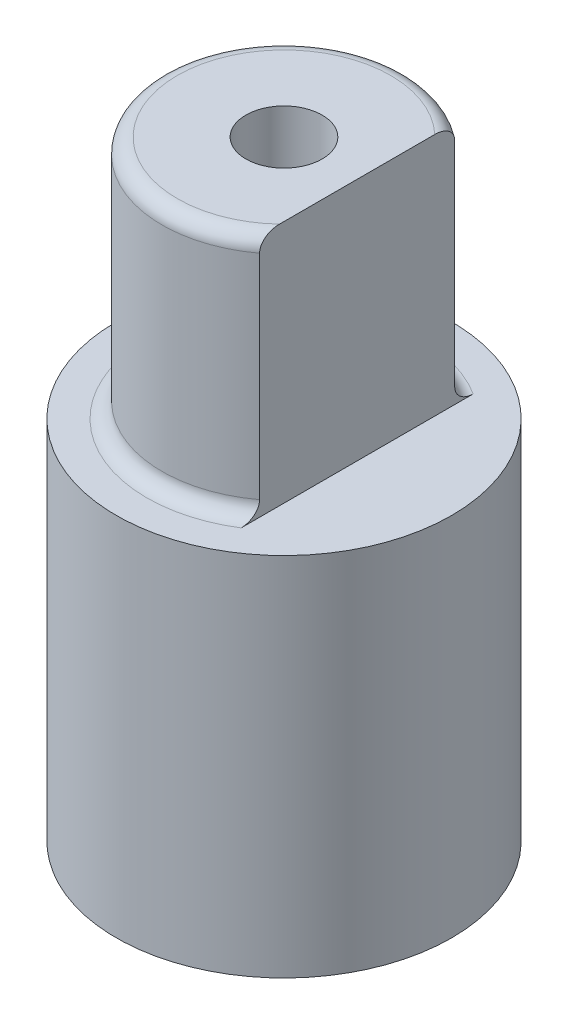
ISO-10303-21;
HEADER;
FILE_DESCRIPTION(('STEP AP214'),'2;1');
FILE_NAME('part.step','',(''),(''),'','','');
FILE_SCHEMA(('AUTOMOTIVE_DESIGN { 1 0 10303 214 1 1 1 1 }'));
ENDSEC;
DATA;
#1=APPLICATION_CONTEXT('core data for automotive mechanical design processes');
#2=APPLICATION_PROTOCOL_DEFINITION('international standard','automotive_design',2000,#1);
#3=PRODUCT_CONTEXT('',#1,'mechanical');
#4=PRODUCT('Part','Part','',(#3));
#5=PRODUCT_RELATED_PRODUCT_CATEGORY('part','',(#4));
#6=PRODUCT_DEFINITION_FORMATION('','',#4);
#7=PRODUCT_DEFINITION_CONTEXT('part definition',#1,'design');
#8=PRODUCT_DEFINITION('design','',#6,#7);
#9=PRODUCT_DEFINITION_SHAPE('','',#8);
#10=(LENGTH_UNIT() NAMED_UNIT(*) SI_UNIT(.MILLI.,.METRE.));
#11=(NAMED_UNIT(*) PLANE_ANGLE_UNIT() SI_UNIT($,.RADIAN.));
#12=(NAMED_UNIT(*) SI_UNIT($,.STERADIAN.) SOLID_ANGLE_UNIT());
#13=UNCERTAINTY_MEASURE_WITH_UNIT(LENGTH_MEASURE(1.E-05),#10,'distance_accuracy_value','');
#14=(GEOMETRIC_REPRESENTATION_CONTEXT(3) GLOBAL_UNCERTAINTY_ASSIGNED_CONTEXT((#13)) GLOBAL_UNIT_ASSIGNED_CONTEXT((#10,
#11,#12)) REPRESENTATION_CONTEXT('',''));
#15=CARTESIAN_POINT('',(0.,0.,0.));
#16=DIRECTION('',(0.,0.,1.));
#17=DIRECTION('',(1.,0.,0.));
#18=AXIS2_PLACEMENT_3D('',#15,#16,#17);
#19=CARTESIAN_POINT('',(-1.,-10.,1.1180339887499));
#20=DIRECTION('',(-1.,0.,0.));
#21=DIRECTION('',(0.,-1.,0.));
#22=AXIS2_PLACEMENT_3D('',#19,#20,#21);
#23=PLANE('',#22);
#24=DIRECTION('',(0.,1.,0.));
#25=VECTOR('',#24,1.);
#26=CARTESIAN_POINT('',(-0.999999999999999,-20.,0.5));
#27=LINE('',#26,#25);
#28=CARTESIAN_POINT('',(-1.,-10.,0.5));
#29=VERTEX_POINT('',#28);
#30=CARTESIAN_POINT('',(-0.999999999999999,-15.8543560762611,0.5));
#31=VERTEX_POINT('',#30);
#32=EDGE_CURVE('E173',#29,#31,#27,.F.);
#33=ORIENTED_EDGE('',*,*,#32,.T.);
#34=CARTESIAN_POINT('',(-0.999999999999999,-17.,0.));
#35=DIRECTION('',(-1.,0.,0.));
#36=DIRECTION('',(0.,-1.,0.));
#37=AXIS2_PLACEMENT_3D('',#34,#35,#36);
#38=CIRCLE('',#37,1.24999999999999);
#39=CARTESIAN_POINT('',(-0.999999999999999,-15.8543560762611,-0.5));
#40=VERTEX_POINT('',#39);
#41=EDGE_CURVE('E155',#31,#40,#38,.T.);
#42=ORIENTED_EDGE('',*,*,#41,.T.);
#43=DIRECTION('',(0.,1.,0.));
#44=VECTOR('',#43,1.);
#45=CARTESIAN_POINT('',(-1.,-10.,-0.5));
#46=LINE('',#45,#44);
#47=CARTESIAN_POINT('',(-1.,-10.,-0.5));
#48=VERTEX_POINT('',#47);
#49=EDGE_CURVE('E170',#40,#48,#46,.T.);
#50=ORIENTED_EDGE('',*,*,#49,.T.);
#51=DIRECTION('',(0.,0.,-1.));
#52=VECTOR('',#51,1.);
#53=CARTESIAN_POINT('',(-1.,-10.,1.1180339887499));
#54=LINE('',#53,#52);
#55=EDGE_CURVE('E338',#29,#48,#54,.T.);
#56=ORIENTED_EDGE('',*,*,#55,.F.);
#57=EDGE_LOOP('',(#33,#42,#50,#56));
#58=FACE_BOUND('',#57,.T.);
#59=ADVANCED_FACE('F69',(#58),#23,.F.);
#60=CARTESIAN_POINT('',(0.,0.,0.));
#61=DIRECTION('',(0.,-1.,0.));
#62=DIRECTION('',(1.,0.,0.));
#63=AXIS2_PLACEMENT_3D('',#60,#61,#62);
#64=PLANE('',#63);
#65=CARTESIAN_POINT('',(0.,0.,0.));
#66=DIRECTION('',(0.,1.,0.));
#67=DIRECTION('',(0.,0.,1.));
#68=AXIS2_PLACEMENT_3D('',#65,#66,#67);
#69=CIRCLE('',#68,1.24999999999999);
#70=CARTESIAN_POINT('',(0.,0.,1.24999999999999));
#71=VERTEX_POINT('',#70);
#72=EDGE_CURVE('E341',#71,#71,#69,.T.);
#73=ORIENTED_EDGE('',*,*,#72,.F.);
#74=EDGE_LOOP('',(#73));
#75=FACE_BOUND('',#74,.T.);
#76=DIRECTION('',(0.,0.,-1.));
#77=VECTOR('',#76,1.);
#78=CARTESIAN_POINT('',(2.4,0.,0.));
#79=LINE('',#78,#77);
#80=CARTESIAN_POINT('',(2.4,0.,2.5475478405714));
#81=VERTEX_POINT('',#80);
#82=CARTESIAN_POINT('',(2.4,0.,-2.5475478405714));
#83=VERTEX_POINT('',#82);
#84=EDGE_CURVE('E335',#81,#83,#79,.T.);
#85=ORIENTED_EDGE('',*,*,#84,.T.);
#86=CARTESIAN_POINT('',(0.,0.,0.));
#87=DIRECTION('',(0.,-1.,0.));
#88=DIRECTION('',(1.,0.,0.));
#89=AXIS2_PLACEMENT_3D('',#86,#87,#88);
#90=CIRCLE('',#89,3.5);
#91=EDGE_CURVE('E164',#83,#81,#90,.F.);
#92=ORIENTED_EDGE('',*,*,#91,.T.);
#93=EDGE_LOOP('',(#85,#92));
#94=FACE_BOUND('',#93,.T.);
#95=ADVANCED_FACE('F288',(#75,#94),#64,.F.);
#96=CARTESIAN_POINT('',(0.,0.,0.));
#97=DIRECTION('',(0.,1.,0.));
#98=DIRECTION('',(-1.,0.,0.));
#99=AXIS2_PLACEMENT_3D('',#96,#97,#98);
#100=CYLINDRICAL_SURFACE('',#99,4.);
#101=DIRECTION('',(0.,1.,0.));
#102=VECTOR('',#101,1.);
#103=CARTESIAN_POINT('',(2.4,0.,3.2));
#104=LINE('',#103,#102);
#105=CARTESIAN_POINT('',(2.4,-7.5,3.2));
#106=VERTEX_POINT('',#105);
#107=CARTESIAN_POINT('',(2.4,-0.5,3.2));
#108=VERTEX_POINT('',#107);
#109=EDGE_CURVE('E272',#106,#108,#104,.T.);
#110=ORIENTED_EDGE('',*,*,#109,.T.);
#111=CARTESIAN_POINT('',(0.,-0.5,0.));
#112=DIRECTION('',(0.,-1.,0.));
#113=DIRECTION('',(1.,0.,0.));
#114=AXIS2_PLACEMENT_3D('',#111,#112,#113);
#115=CIRCLE('',#114,4.);
#116=CARTESIAN_POINT('',(2.4,-0.5,-3.2));
#117=VERTEX_POINT('',#116);
#118=EDGE_CURVE('E257',#108,#117,#115,.T.);
#119=ORIENTED_EDGE('',*,*,#118,.T.);
#120=DIRECTION('',(0.,1.,0.));
#121=VECTOR('',#120,1.);
#122=CARTESIAN_POINT('',(2.4,0.,-3.2));
#123=LINE('',#122,#121);
#124=CARTESIAN_POINT('',(2.4,-7.5,-3.2));
#125=VERTEX_POINT('',#124);
#126=EDGE_CURVE('E370',#117,#125,#123,.F.);
#127=ORIENTED_EDGE('',*,*,#126,.T.);
#128=CARTESIAN_POINT('',(0.,-7.5,0.));
#129=DIRECTION('',(0.,-1.,0.));
#130=DIRECTION('',(1.,0.,0.));
#131=AXIS2_PLACEMENT_3D('',#128,#129,#130);
#132=CIRCLE('',#131,4.);
#133=EDGE_CURVE('E253',#125,#106,#132,.F.);
#134=ORIENTED_EDGE('',*,*,#133,.T.);
#135=EDGE_LOOP('',(#110,#119,#127,#134));
#136=FACE_BOUND('',#135,.T.);
#137=ADVANCED_FACE('F279',(#136),#100,.T.);
#138=CARTESIAN_POINT('',(4.,-8.,0.));
#139=DIRECTION('',(0.,-1.,0.));
#140=DIRECTION('',(1.,0.,0.));
#141=AXIS2_PLACEMENT_3D('',#138,#139,#140);
#142=PLANE('',#141);
#143=CARTESIAN_POINT('',(0.,-8.,0.));
#144=DIRECTION('',(0.,1.,0.));
#145=DIRECTION('',(-1.,0.,0.));
#146=AXIS2_PLACEMENT_3D('',#143,#144,#145);
#147=CIRCLE('',#146,5.5);
#148=CARTESIAN_POINT('',(-5.5,-8.,0.));
#149=VERTEX_POINT('',#148);
#150=EDGE_CURVE('E353',#149,#149,#147,.T.);
#151=ORIENTED_EDGE('',*,*,#150,.T.);
#152=EDGE_LOOP('',(#151));
#153=FACE_BOUND('',#152,.T.);
#154=DIRECTION('',(0.,0.,-1.));
#155=VECTOR('',#154,1.);
#156=CARTESIAN_POINT('',(2.4,-8.,4.6356245595668));
#157=LINE('',#156,#155);
#158=CARTESIAN_POINT('',(2.4,-8.,3.80657326213486));
#159=VERTEX_POINT('',#158);
#160=CARTESIAN_POINT('',(2.4,-8.,-3.80657326213485));
#161=VERTEX_POINT('',#160);
#162=EDGE_CURVE('E90',#159,#161,#157,.T.);
#163=ORIENTED_EDGE('',*,*,#162,.F.);
#164=CARTESIAN_POINT('',(0.,-8.,0.));
#165=DIRECTION('',(0.,-1.,0.));
#166=DIRECTION('',(1.,0.,0.));
#167=AXIS2_PLACEMENT_3D('',#164,#165,#166);
#168=CIRCLE('',#167,4.5);
#169=EDGE_CURVE('E260',#159,#161,#168,.T.);
#170=ORIENTED_EDGE('',*,*,#169,.T.);
#171=EDGE_LOOP('',(#163,#170));
#172=FACE_BOUND('',#171,.T.);
#173=ADVANCED_FACE('F276',(#153,#172),#142,.F.);
#174=CARTESIAN_POINT('',(0.,0.,0.));
#175=DIRECTION('',(0.,1.,0.));
#176=DIRECTION('',(-1.,0.,0.));
#177=AXIS2_PLACEMENT_3D('',#174,#175,#176);
#178=CYLINDRICAL_SURFACE('',#177,5.5);
#179=CARTESIAN_POINT('',(-5.5,-18.25,0.));
#180=CARTESIAN_POINT('',(-5.49999873675926,-18.2499977340868,-0.0692591392984516));
#181=CARTESIAN_POINT('',(-5.49867854673065,-18.2442243862115,-0.138545086129003));
#182=CARTESIAN_POINT('',(-5.493539660153,-18.2213102619691,-0.275144297299659));
#183=CARTESIAN_POINT('',(-5.48971927481324,-18.2041618020224,-0.342456196110362));
#184=CARTESIAN_POINT('',(-5.48000476561469,-18.159065975684,-0.473113835992455));
#185=CARTESIAN_POINT('',(-5.4741128942837,-18.1311303360096,-0.536463797478233));
#186=CARTESIAN_POINT('',(-5.46088910081351,-18.0652914433096,-0.657576137912826));
#187=CARTESIAN_POINT('',(-5.45355719301993,-18.0273882895788,-0.715338572515906));
#188=CARTESIAN_POINT('',(-5.4381132908407,-17.9419989776967,-0.824633802223185));
#189=CARTESIAN_POINT('',(-5.42999098791629,-17.8943737132625,-0.87605646946024));
#190=CARTESIAN_POINT('',(-5.41395325591652,-17.7911905129314,-0.970256949083046));
#191=CARTESIAN_POINT('',(-5.40603784654666,-17.7356318246528,-1.01303394060891));
#192=CARTESIAN_POINT('',(-5.39120791846105,-17.6173339723581,-1.08922299700893));
#193=CARTESIAN_POINT('',(-5.38430657902887,-17.5545165018471,-1.12251627178287));
#194=CARTESIAN_POINT('',(-5.37243480737543,-17.4239952497092,-1.17803034858934));
#195=CARTESIAN_POINT('',(-5.36746412440839,-17.3562921039692,-1.20025258858874));
#196=CARTESIAN_POINT('',(-5.36012172349153,-17.2191204064417,-1.23262674706358));
#197=CARTESIAN_POINT('',(-5.35770789866951,-17.1497003684387,-1.24297446340376));
#198=CARTESIAN_POINT('',(-5.35562617033839,-17.0100708863934,-1.25191494225742));
#199=CARTESIAN_POINT('',(-5.35595790132902,-16.9398615486689,-1.25050926943275));
#200=CARTESIAN_POINT('',(-5.35929175179597,-16.8021135583257,-1.2361400847938));
#201=CARTESIAN_POINT('',(-5.36224097064878,-16.7345495469025,-1.22340552299718));
#202=CARTESIAN_POINT('',(-5.37039368363716,-16.6025427569226,-1.1871034246025));
#203=CARTESIAN_POINT('',(-5.3755973132372,-16.5381001661864,-1.16353523702143));
#204=CARTESIAN_POINT('',(-5.38772371922684,-16.4135296640947,-1.10602867201271));
#205=CARTESIAN_POINT('',(-5.39466077989125,-16.3534432411182,-1.07200356043003));
#206=CARTESIAN_POINT('',(-5.40946384216207,-16.2397487234445,-0.994609889602029));
#207=CARTESIAN_POINT('',(-5.41732997981732,-16.186141579868,-0.951239961185661));
#208=CARTESIAN_POINT('',(-5.43333076436253,-16.0856107190895,-0.855182590017572));
#209=CARTESIAN_POINT('',(-5.44146738675749,-16.0388727867418,-0.802300833714127));
#210=CARTESIAN_POINT('',(-5.45692512985791,-15.9548970556465,-0.689356149204851));
#211=CARTESIAN_POINT('',(-5.46424623341467,-15.9176594566503,-0.629293070045391));
#212=CARTESIAN_POINT('',(-5.47727487123187,-15.8536898060143,-0.503453995899568));
#213=CARTESIAN_POINT('',(-5.48297842424367,-15.8269836131888,-0.437664417174071));
#214=CARTESIAN_POINT('',(-5.49209994783491,-15.785057997066,-0.302372561245843));
#215=CARTESIAN_POINT('',(-5.4955182778892,-15.7698367670889,-0.232870869831855));
#216=CARTESIAN_POINT('',(-5.4996325035878,-15.7515868812637,-0.093719920096362));
#217=CARTESIAN_POINT('',(-5.50038500920564,-15.7483046543416,-0.0241055461685153));
#218=CARTESIAN_POINT('',(-5.49924211275316,-15.7533365199265,0.114676943340055));
#219=CARTESIAN_POINT('',(-5.49734690539558,-15.761649759703,0.183845091360432));
#220=CARTESIAN_POINT('',(-5.49115740518708,-15.7894265834527,0.318920838609232));
#221=CARTESIAN_POINT('',(-5.4868920435275,-15.8087557732219,0.384857518407215));
#222=CARTESIAN_POINT('',(-5.47644030661836,-15.8578655137285,0.512551965438804));
#223=CARTESIAN_POINT('',(-5.47025375902772,-15.8876470021266,0.574309357161445));
#224=CARTESIAN_POINT('',(-5.45650716375474,-15.9573345717777,0.69293042628028));
#225=CARTESIAN_POINT('',(-5.4489276492766,-15.9973878133866,0.749705342613596));
#226=CARTESIAN_POINT('',(-5.43327304782299,-16.0862896642201,0.855818867895259));
#227=CARTESIAN_POINT('',(-5.42519789109562,-16.1351395132734,0.905156426789846));
#228=CARTESIAN_POINT('',(-5.40926438572434,-16.2414154825667,0.996008531090476));
#229=CARTESIAN_POINT('',(-5.40141360596267,-16.2989936208934,1.03734683297031));
#230=CARTESIAN_POINT('',(-5.3870011660802,-16.4204231953351,1.10976907203276));
#231=CARTESIAN_POINT('',(-5.38043944897962,-16.4842743539798,1.14085346250508));
#232=CARTESIAN_POINT('',(-5.36941374353368,-16.6160902347845,1.19166798620963));
#233=CARTESIAN_POINT('',(-5.3649376890851,-16.6840286618717,1.21146358110852));
#234=CARTESIAN_POINT('',(-5.35857055292907,-16.8223834533496,1.23932629170182));
#235=CARTESIAN_POINT('',(-5.35667901955397,-16.8927993825682,1.24739545670806));
#236=CARTESIAN_POINT('',(-5.35572514716112,-17.0323293096555,1.25148369607082));
#237=CARTESIAN_POINT('',(-5.35659707290885,-17.1014347996668,1.24778274250535));
#238=CARTESIAN_POINT('',(-5.3609223423457,-17.2380094550941,1.22906557701641));
#239=CARTESIAN_POINT('',(-5.36437565044739,-17.3054786430552,1.21404952108504));
#240=CARTESIAN_POINT('',(-5.37344130135242,-17.4366216986831,1.17326846180304));
#241=CARTESIAN_POINT('',(-5.37904483343351,-17.5003098455708,1.14754728763997));
#242=CARTESIAN_POINT('',(-5.39178236164053,-17.6225073534503,1.08612268303439));
#243=CARTESIAN_POINT('',(-5.39891653159829,-17.6810161251628,1.05041811865611));
#244=CARTESIAN_POINT('',(-5.41410553631702,-17.7925672138276,0.969124984455239));
#245=CARTESIAN_POINT('',(-5.42217702793932,-17.8454628611037,0.923338228214164));
#246=CARTESIAN_POINT('',(-5.43822274296525,-17.942911592541,0.823578144662081));
#247=CARTESIAN_POINT('',(-5.44619694333323,-17.987462735483,0.769602917703372));
#248=CARTESIAN_POINT('',(-5.46128466945207,-18.0675690301169,0.654070302575277));
#249=CARTESIAN_POINT('',(-5.46838430808557,-18.1029869116666,0.592415810938094));
#250=CARTESIAN_POINT('',(-5.48078202756997,-18.1628999853315,0.46387798385584));
#251=CARTESIAN_POINT('',(-5.48608156233362,-18.1874039973933,0.396998922168843));
#252=CARTESIAN_POINT('',(-5.49337797563919,-18.2206139530881,0.275081535769807));
#253=CARTESIAN_POINT('',(-5.49584542792493,-18.2316119938446,0.220684055569242));
#254=CARTESIAN_POINT('',(-5.49915690403688,-18.2463057367897,0.110863407465457));
#255=CARTESIAN_POINT('',(-5.50000101119415,-18.2500018138096,0.0554402923585498));
#256=CARTESIAN_POINT('',(-5.5,-18.25,0.));
#257=B_SPLINE_CURVE_WITH_KNOTS('',3,(#179,#180,#181,#182,#183,#184,#185,#186,#187,#188,#189,
#190,#191,#192,#193,#194,#195,#196,#197,#198,#199,#200,#201,#202,#203,#204,#205,#206,#207,#208,
#209,#210,#211,#212,#213,#214,#215,#216,#217,#218,#219,#220,#221,#222,#223,#224,#225,#226,#227,
#228,#229,#230,#231,#232,#233,#234,#235,#236,#237,#238,#239,#240,#241,#242,#243,#244,#245,#246,
#247,#248,#249,#250,#251,#252,#253,#254,#255,#256),.UNSPECIFIED.,.T.,.F.,(4,2,2,2,2,2,2,2,2,2,2,
2,2,2,2,2,2,2,2,2,2,2,2,2,2,2,2,2,2,2,2,2,2,2,2,2,2,2,4),(0.,0.207574424816656,
0.415289203498462,0.622778808776588,0.83026634715262,1.04096194698404,1.251677541829,
1.46492681486706,1.67814838269118,1.8878012244904,2.09742615684378,2.30290857087116,
2.50840333376984,2.71565078719423,2.92292862648987,3.1350576590185,3.34719115134929,
3.55984232048321,3.77246003084945,3.98053470958378,4.18859408731811,4.39416788074515,
4.59976012061539,4.80848064664381,5.01723061362834,5.23015660770195,5.44307318779736,
5.65474220954491,5.86637423554696,6.07301021975724,6.27964335529764,6.48543868288069,
6.69125739465897,6.9015551289295,7.11190172510029,7.32524638726728,7.53841832261073,
7.70458523862174,7.87074362456996),.UNSPECIFIED.);
#258=CARTESIAN_POINT('',(-5.5,-18.25,0.));
#259=VERTEX_POINT('',#258);
#260=EDGE_CURVE('E227',#259,#259,#257,.T.);
#261=ORIENTED_EDGE('',*,*,#260,.T.);
#262=EDGE_LOOP('',(#261));
#263=FACE_BOUND('',#262,.T.);
#264=ORIENTED_EDGE('',*,*,#150,.F.);
#265=EDGE_LOOP('',(#264));
#266=FACE_BOUND('',#265,.T.);
#267=CARTESIAN_POINT('',(0.,-20.,0.));
#268=DIRECTION('',(0.,1.,0.));
#269=DIRECTION('',(-1.,0.,0.));
#270=AXIS2_PLACEMENT_3D('',#267,#268,#269);
#271=CIRCLE('',#270,5.5);
#272=CARTESIAN_POINT('',(-5.5,-20.,0.));
#273=VERTEX_POINT('',#272);
#274=EDGE_CURVE('E349',#273,#273,#271,.T.);
#275=ORIENTED_EDGE('',*,*,#274,.T.);
#276=EDGE_LOOP('',(#275));
#277=FACE_BOUND('',#276,.T.);
#278=ADVANCED_FACE('F278',(#263,#266,#277),#178,.T.);
#279=CARTESIAN_POINT('',(5.5,-20.,0.));
#280=DIRECTION('',(0.,1.,0.));
#281=DIRECTION('',(-1.,0.,0.));
#282=AXIS2_PLACEMENT_3D('',#279,#280,#281);
#283=PLANE('',#282);
#284=DIRECTION('',(0.,0.,-1.));
#285=VECTOR('',#284,1.);
#286=CARTESIAN_POINT('',(-0.999999999999999,-20.,1.1180339887499));
#287=LINE('',#286,#285);
#288=CARTESIAN_POINT('',(-0.999999999999999,-20.,0.5));
#289=VERTEX_POINT('',#288);
#290=CARTESIAN_POINT('',(-0.999999999999999,-20.,-0.5));
#291=VERTEX_POINT('',#290);
#292=EDGE_CURVE('E314',#289,#291,#287,.T.);
#293=ORIENTED_EDGE('',*,*,#292,.F.);
#294=CARTESIAN_POINT('',(0.,-20.,0.5));
#295=DIRECTION('',(0.,1.,0.));
#296=DIRECTION('',(-1.,0.,0.));
#297=AXIS2_PLACEMENT_3D('',#294,#295,#296);
#298=CIRCLE('',#297,1.);
#299=CARTESIAN_POINT('',(0.,-20.,1.5));
#300=VERTEX_POINT('',#299);
#301=EDGE_CURVE('E165',#289,#300,#298,.T.);
#302=ORIENTED_EDGE('',*,*,#301,.T.);
#303=CARTESIAN_POINT('',(0.,-20.,0.));
#304=DIRECTION('',(0.,-1.,0.));
#305=DIRECTION('',(1.,0.,0.));
#306=AXIS2_PLACEMENT_3D('',#303,#304,#305);
#307=CIRCLE('',#306,1.5);
#308=CARTESIAN_POINT('',(0.,-20.,-1.5));
#309=VERTEX_POINT('',#308);
#310=EDGE_CURVE('E321',#309,#300,#307,.T.);
#311=ORIENTED_EDGE('',*,*,#310,.F.);
#312=CARTESIAN_POINT('',(0.,-20.,-0.5));
#313=DIRECTION('',(0.,1.,0.));
#314=DIRECTION('',(-1.,0.,0.));
#315=AXIS2_PLACEMENT_3D('',#312,#313,#314);
#316=CIRCLE('',#315,1.);
#317=EDGE_CURVE('E196',#309,#291,#316,.T.);
#318=ORIENTED_EDGE('',*,*,#317,.T.);
#319=EDGE_LOOP('',(#293,#302,#311,#318));
#320=FACE_BOUND('',#319,.T.);
#321=ORIENTED_EDGE('',*,*,#274,.F.);
#322=EDGE_LOOP('',(#321));
#323=FACE_BOUND('',#322,.T.);
#324=ADVANCED_FACE('F286',(#320,#323),#283,.F.);
#325=CARTESIAN_POINT('',(0.,-7.24892422621555,0.));
#326=DIRECTION('',(0.,1.,0.));
#327=DIRECTION('',(0.,0.,1.));
#328=AXIS2_PLACEMENT_3D('',#325,#326,#327);
#329=CONICAL_SURFACE('',#328,1.25,1.02974425867665);
#330=CARTESIAN_POINT('',(0.,-8.,0.));
#331=VERTEX_POINT('',#330);
#332=VERTEX_LOOP('',#331);
#333=FACE_BOUND('',#332,.T.);
#334=CARTESIAN_POINT('',(0.,-7.24892422621555,0.));
#335=DIRECTION('',(0.,1.,0.));
#336=DIRECTION('',(0.,0.,1.));
#337=AXIS2_PLACEMENT_3D('',#334,#335,#336);
#338=CIRCLE('',#337,1.25);
#339=CARTESIAN_POINT('',(0.,-7.24892422621555,1.25));
#340=VERTEX_POINT('',#339);
#341=EDGE_CURVE('E345',#340,#340,#338,.T.);
#342=ORIENTED_EDGE('',*,*,#341,.T.);
#343=EDGE_LOOP('',(#342));
#344=FACE_BOUND('',#343,.T.);
#345=ADVANCED_FACE('F384',(#333,#344),#329,.F.);
#346=CARTESIAN_POINT('',(0.,0.,0.));
#347=DIRECTION('',(0.,1.,0.));
#348=DIRECTION('',(0.,0.,1.));
#349=AXIS2_PLACEMENT_3D('',#346,#347,#348);
#350=CYLINDRICAL_SURFACE('',#349,1.24999999999999);
#351=ORIENTED_EDGE('',*,*,#341,.F.);
#352=EDGE_LOOP('',(#351));
#353=FACE_BOUND('',#352,.T.);
#354=ORIENTED_EDGE('',*,*,#72,.T.);
#355=EDGE_LOOP('',(#354));
#356=FACE_BOUND('',#355,.T.);
#357=ADVANCED_FACE('F309',(#353,#356),#350,.F.);
#358=CARTESIAN_POINT('',(0.,-10.,0.));
#359=DIRECTION('',(0.,-1.,0.));
#360=DIRECTION('',(1.,0.,0.));
#361=AXIS2_PLACEMENT_3D('',#358,#359,#360);
#362=CYLINDRICAL_SURFACE('',#361,1.5);
#363=CARTESIAN_POINT('',(0.,-10.,0.));
#364=DIRECTION('',(0.,-1.,0.));
#365=DIRECTION('',(1.,0.,0.));
#366=AXIS2_PLACEMENT_3D('',#363,#364,#365);
#367=CIRCLE('',#366,1.5);
#368=CARTESIAN_POINT('',(0.,-10.,-1.5));
#369=VERTEX_POINT('',#368);
#370=CARTESIAN_POINT('',(0.,-10.,1.5));
#371=VERTEX_POINT('',#370);
#372=EDGE_CURVE('E324',#369,#371,#367,.T.);
#373=ORIENTED_EDGE('',*,*,#372,.F.);
#374=DIRECTION('',(0.,-1.,0.));
#375=VECTOR('',#374,1.);
#376=CARTESIAN_POINT('',(0.,-10.,-1.5));
#377=LINE('',#376,#375);
#378=EDGE_CURVE('E316',#369,#309,#377,.T.);
#379=ORIENTED_EDGE('',*,*,#378,.T.);
#380=ORIENTED_EDGE('',*,*,#310,.T.);
#381=DIRECTION('',(0.,-1.,0.));
#382=VECTOR('',#381,1.);
#383=CARTESIAN_POINT('',(0.,-10.,1.5));
#384=LINE('',#383,#382);
#385=EDGE_CURVE('E326',#300,#371,#384,.F.);
#386=ORIENTED_EDGE('',*,*,#385,.T.);
#387=EDGE_LOOP('',(#373,#379,#380,#386));
#388=FACE_BOUND('',#387,.T.);
#389=ADVANCED_FACE('F301',(#388),#362,.F.);
#390=CARTESIAN_POINT('',(-0.999999999999999,-18.145643923739,-0.5));
#391=VERTEX_POINT('',#390);
#392=EDGE_CURVE('E182',#291,#391,#46,.T.);
#393=ORIENTED_EDGE('',*,*,#392,.T.);
#394=CARTESIAN_POINT('',(-0.999999999999999,-18.145643923739,0.5));
#395=VERTEX_POINT('',#394);
#396=EDGE_CURVE('E158',#391,#395,#38,.T.);
#397=ORIENTED_EDGE('',*,*,#396,.T.);
#398=EDGE_CURVE('E188',#395,#289,#27,.F.);
#399=ORIENTED_EDGE('',*,*,#398,.T.);
#400=ORIENTED_EDGE('',*,*,#292,.T.);
#401=EDGE_LOOP('',(#393,#397,#399,#400));
#402=FACE_BOUND('',#401,.T.);
#403=ADVANCED_FACE('F293',(#402),#23,.F.);
#404=CARTESIAN_POINT('',(0.500000000000002,-10.,0.));
#405=DIRECTION('',(0.,1.,0.));
#406=DIRECTION('',(-1.,0.,0.));
#407=AXIS2_PLACEMENT_3D('',#404,#405,#406);
#408=PLANE('',#407);
#409=ORIENTED_EDGE('',*,*,#55,.T.);
#410=CARTESIAN_POINT('',(0.,-10.,-0.5));
#411=DIRECTION('',(0.,1.,0.));
#412=DIRECTION('',(-1.,0.,0.));
#413=AXIS2_PLACEMENT_3D('',#410,#411,#412);
#414=CIRCLE('',#413,1.);
#415=EDGE_CURVE('E180',#48,#369,#414,.F.);
#416=ORIENTED_EDGE('',*,*,#415,.T.);
#417=ORIENTED_EDGE('',*,*,#372,.T.);
#418=CARTESIAN_POINT('',(0.,-10.,0.5));
#419=DIRECTION('',(0.,1.,0.));
#420=DIRECTION('',(-1.,0.,0.));
#421=AXIS2_PLACEMENT_3D('',#418,#419,#420);
#422=CIRCLE('',#421,1.);
#423=EDGE_CURVE('E187',#371,#29,#422,.F.);
#424=ORIENTED_EDGE('',*,*,#423,.T.);
#425=EDGE_LOOP('',(#409,#416,#417,#424));
#426=FACE_BOUND('',#425,.T.);
#427=ADVANCED_FACE('F300',(#426),#408,.F.);
#428=CARTESIAN_POINT('',(2.4,0.,0.));
#429=DIRECTION('',(-1.,0.,0.));
#430=DIRECTION('',(0.,0.,1.));
#431=AXIS2_PLACEMENT_3D('',#428,#429,#430);
#432=PLANE('',#431);
#433=ORIENTED_EDGE('',*,*,#84,.F.);
#434=CARTESIAN_POINT('',(2.4,0.,2.5475478405714));
#435=CARTESIAN_POINT('',(2.4,-1.12807757479852E-05,2.58955290709653));
#436=CARTESIAN_POINT('',(2.4,-0.00280936579565406,2.63167336703548));
#437=CARTESIAN_POINT('',(2.4,-0.0145413247071873,2.7153848450671));
#438=CARTESIAN_POINT('',(2.4,-0.0235249641803001,2.75696876148894));
#439=CARTESIAN_POINT('',(2.4,-0.0464277471820711,2.83227558199261));
#440=CARTESIAN_POINT('',(2.4,-0.0594484191645843,2.86626737992095));
#441=CARTESIAN_POINT('',(2.4,-0.0907117812252915,2.93169328346518));
#442=CARTESIAN_POINT('',(2.4,-0.108938713907329,2.96313474475374));
#443=CARTESIAN_POINT('',(2.4,-0.146666786055831,3.0163870557038));
#444=CARTESIAN_POINT('',(2.4,-0.165209554879277,3.0388749297686));
#445=CARTESIAN_POINT('',(2.4,-0.205729142675119,3.0805418432005));
#446=CARTESIAN_POINT('',(2.4,-0.227703804789111,3.0997229449685));
#447=CARTESIAN_POINT('',(2.4,-0.271208688838,3.13121742631731));
#448=CARTESIAN_POINT('',(2.4,-0.292303847757332,3.14413067893514));
#449=CARTESIAN_POINT('',(2.4,-0.336340457536559,3.16625477375188));
#450=CARTESIAN_POINT('',(2.4,-0.359279019652661,3.17547127827005));
#451=CARTESIAN_POINT('',(2.4,-0.401789191159141,3.18830192320987));
#452=CARTESIAN_POINT('',(2.4,-0.42113781728336,3.19266066481722));
#453=CARTESIAN_POINT('',(2.4,-0.460317109635343,3.19852300572014));
#454=CARTESIAN_POINT('',(2.4,-0.480148991156478,3.20001844300339));
#455=CARTESIAN_POINT('',(2.4,-0.5,3.2));
#456=B_SPLINE_CURVE_WITH_KNOTS('',3,(#434,#435,#436,#437,#438,#439,#440,#441,#442,#443,#444,
#445,#446,#447,#448,#449,#450,#451,#452,#453,#454,#455),.UNSPECIFIED.,.F.,.F.,(4,2,2,2,2,2,2,2,
2,2,4),(0.,0.126108699959529,0.253244041938035,0.362046986252161,0.470524052276937,
0.557631355979102,0.644684133619686,0.71857607637423,0.792354402419765,0.85164992995555,
0.911114232590433),.UNSPECIFIED.);
#457=EDGE_CURVE('E246',#81,#108,#456,.T.);
#458=ORIENTED_EDGE('',*,*,#457,.T.);
#459=ORIENTED_EDGE('',*,*,#109,.F.);
#460=CARTESIAN_POINT('',(2.4,-7.5,3.2));
#461=CARTESIAN_POINT('',(2.4,-7.52432696639831,3.19995255618728));
#462=CARTESIAN_POINT('',(2.4,-7.54860959458765,3.20221599129909));
#463=CARTESIAN_POINT('',(2.4,-7.59624985276426,3.21096372704761));
#464=CARTESIAN_POINT('',(2.4,-7.61961237919882,3.21742112120387));
#465=CARTESIAN_POINT('',(2.4,-7.6648608423317,3.2341494878743));
#466=CARTESIAN_POINT('',(2.4,-7.68674941573911,3.24441342463227));
#467=CARTESIAN_POINT('',(2.4,-7.72869277056759,3.2682093384418));
#468=CARTESIAN_POINT('',(2.4,-7.74874480302265,3.28174610755529));
#469=CARTESIAN_POINT('',(2.4,-7.788207520545,3.31269286378003));
#470=CARTESIAN_POINT('',(2.4,-7.80744415069839,3.33032354770973));
#471=CARTESIAN_POINT('',(2.4,-7.84326187136689,3.36808269015585));
#472=CARTESIAN_POINT('',(2.4,-7.85984247275271,3.38821160753371));
#473=CARTESIAN_POINT('',(2.4,-7.89320966381629,3.43449858813345));
#474=CARTESIAN_POINT('',(2.4,-7.90942127886509,3.46107130054442));
#475=CARTESIAN_POINT('',(2.4,-7.93792234394377,3.51626335260144));
#476=CARTESIAN_POINT('',(2.4,-7.95020637886279,3.54488545188377));
#477=CARTESIAN_POINT('',(2.4,-7.97358814037642,3.61147368219907));
#478=CARTESIAN_POINT('',(2.4,-7.98346529477559,3.64987242109705));
#479=CARTESIAN_POINT('',(2.4,-7.99666305163682,3.72771453471162));
#480=CARTESIAN_POINT('',(2.4,-7.99999485800985,3.76715600701675));
#481=CARTESIAN_POINT('',(2.4,-8.,3.80657326213486));
#482=B_SPLINE_CURVE_WITH_KNOTS('',3,(#460,#461,#462,#463,#464,#465,#466,#467,#468,#469,#470,
#471,#472,#473,#474,#475,#476,#477,#478,#479,#480,#481),.UNSPECIFIED.,.F.,.F.,(4,2,2,2,2,2,2,2,
2,2,4),(0.,0.0728057444245214,0.145148954500466,0.217359111326477,0.289675645054997,
0.367671764721432,0.445682231535665,0.538712395988351,0.631870277191321,0.750237472582614,
0.868401877371779),.UNSPECIFIED.);
#483=EDGE_CURVE('E84',#106,#159,#482,.T.);
#484=ORIENTED_EDGE('',*,*,#483,.T.);
#485=ORIENTED_EDGE('',*,*,#162,.T.);
#486=CARTESIAN_POINT('',(2.4,-8.,-3.80657326213486));
#487=CARTESIAN_POINT('',(2.4,-7.99999020376149,-3.76413934220145));
#488=CARTESIAN_POINT('',(2.4,-7.99613200423801,-3.72168160971086));
#489=CARTESIAN_POINT('',(2.4,-7.98081394259661,-3.63785707807488));
#490=CARTESIAN_POINT('',(2.4,-7.96930130400309,-3.59649994098288));
#491=CARTESIAN_POINT('',(2.4,-7.9399038302817,-3.51960342140825));
#492=CARTESIAN_POINT('',(2.4,-7.92255403886522,-3.48386001408639));
#493=CARTESIAN_POINT('',(2.4,-7.88153109772014,-3.41629879937096));
#494=CARTESIAN_POINT('',(2.4,-7.85788139821907,-3.38446706087357));
#495=CARTESIAN_POINT('',(2.4,-7.81236651603984,-3.33498953546322));
#496=CARTESIAN_POINT('',(2.4,-7.79203279125159,-3.31592896502225));
#497=CARTESIAN_POINT('',(2.4,-7.7485068843526,-3.2813495211559));
#498=CARTESIAN_POINT('',(2.4,-7.7253146365059,-3.26583072920237));
#499=CARTESIAN_POINT('',(2.4,-7.67627064509326,-3.23908582154642));
#500=CARTESIAN_POINT('',(2.4,-7.65039623190337,-3.22790085117428));
#501=CARTESIAN_POINT('',(2.4,-7.5969652697445,-3.21090286842143));
#502=CARTESIAN_POINT('',(2.4,-7.56941409859098,-3.20507355658029));
#503=CARTESIAN_POINT('',(2.4,-7.53469791144639,-3.20144534928037));
#504=CARTESIAN_POINT('',(2.4,-7.52776527124916,-3.2009034695168));
#505=CARTESIAN_POINT('',(2.4,-7.51388956349752,-3.2001814209946));
#506=CARTESIAN_POINT('',(2.4,-7.50694651865477,-3.20000081609474));
#507=CARTESIAN_POINT('',(2.4,-7.5,-3.2));
#508=B_SPLINE_CURVE_WITH_KNOTS('',3,(#486,#487,#488,#489,#490,#491,#492,#493,#494,#495,#496,
#497,#498,#499,#500,#501,#502,#503,#504,#505,#506,#507),.UNSPECIFIED.,.F.,.F.,(4,2,2,2,2,2,2,2,
2,2,4),(0.,0.127179457002092,0.255245023253745,0.373826476144139,0.491972554586445,
0.575267722013744,0.658564805293966,0.74263439163126,0.826447263975927,0.847302739522004,
0.868133022516736),.UNSPECIFIED.);
#509=EDGE_CURVE('E12',#161,#125,#508,.T.);
#510=ORIENTED_EDGE('',*,*,#509,.T.);
#511=ORIENTED_EDGE('',*,*,#126,.F.);
#512=CARTESIAN_POINT('',(2.4,-0.5,-3.2));
#513=CARTESIAN_POINT('',(2.4,-0.47599733480188,-3.2000418399178));
#514=CARTESIAN_POINT('',(2.4,-0.452029694591131,-3.1978426689473));
#515=CARTESIAN_POINT('',(2.4,-0.40497447670814,-3.18930687079013));
#516=CARTESIAN_POINT('',(2.4,-0.381882758538693,-3.18299323637251));
#517=CARTESIAN_POINT('',(2.4,-0.337137802728164,-3.16657710578402));
#518=CARTESIAN_POINT('',(2.4,-0.315482717769898,-3.15647959085878));
#519=CARTESIAN_POINT('',(2.4,-0.274019097651681,-3.1329998049646));
#520=CARTESIAN_POINT('',(2.4,-0.254212754663368,-3.11961370110458));
#521=CARTESIAN_POINT('',(2.4,-0.21559243209694,-3.08918438443022));
#522=CARTESIAN_POINT('',(2.4,-0.19691838965913,-3.07196458012141));
#523=CARTESIAN_POINT('',(2.4,-0.162188825722624,-3.03508725444841));
#524=CARTESIAN_POINT('',(2.4,-0.146133571807927,-3.01542948433721));
#525=CARTESIAN_POINT('',(2.4,-0.10982519035094,-2.96466078630822));
#526=CARTESIAN_POINT('',(2.4,-0.0910797499744734,-2.93246711474653));
#527=CARTESIAN_POINT('',(2.4,-0.0590291748314043,-2.86538621545552));
#528=CARTESIAN_POINT('',(2.4,-0.0457460647789147,-2.83048874447901));
#529=CARTESIAN_POINT('',(2.4,-0.0229834306391653,-2.75463661956981));
#530=CARTESIAN_POINT('',(2.4,-0.0142023558779782,-2.71347601542883));
#531=CARTESIAN_POINT('',(2.4,-0.00274388968501327,-2.63068501548732));
#532=CARTESIAN_POINT('',(2.4,-1.10939297624054E-05,-2.58906242429578));
#533=CARTESIAN_POINT('',(2.4,0.,-2.5475478405714));
#534=B_SPLINE_CURVE_WITH_KNOTS('',3,(#512,#513,#514,#515,#516,#517,#518,#519,#520,#521,#522,
#523,#524,#525,#526,#527,#528,#529,#530,#531,#532,#533),.UNSPECIFIED.,.F.,.F.,(4,2,2,2,2,2,2,2,
2,2,4),(0.,0.0718522009652794,0.143306275726742,0.214666614175585,0.28611052188015,
0.362030909245294,0.437959049192132,0.549109817212372,0.660704463847956,0.78648951507203,
0.911117477883951),.UNSPECIFIED.);
#535=EDGE_CURVE('E240',#117,#83,#534,.T.);
#536=ORIENTED_EDGE('',*,*,#535,.T.);
#537=EDGE_LOOP('',(#433,#458,#459,#484,#485,#510,#511,#536));
#538=FACE_BOUND('',#537,.T.);
#539=ADVANCED_FACE('F215',(#538),#432,.F.);
#540=CARTESIAN_POINT('',(0.,-10.,-0.5));
#541=DIRECTION('',(0.,-1.,0.));
#542=DIRECTION('',(1.,0.,0.));
#543=AXIS2_PLACEMENT_3D('',#540,#541,#542);
#544=CYLINDRICAL_SURFACE('',#543,1.);
#545=ORIENTED_EDGE('',*,*,#49,.F.);
#546=CARTESIAN_POINT('',(-0.999999999999999,-15.8543560762611,-0.5));
#547=CARTESIAN_POINT('',(-1.00000260362263,-15.8660804979476,-0.526875576117939));
#548=CARTESIAN_POINT('',(-0.998916638077376,-15.8787478460796,-0.553308431606295));
#549=CARTESIAN_POINT('',(-0.994803138968951,-15.9058117857834,-0.605062832647471));
#550=CARTESIAN_POINT('',(-0.991778880253621,-15.920205427412,-0.630386175825595));
#551=CARTESIAN_POINT('',(-0.980231039098014,-15.9654677913534,-0.703938650116241));
#552=CARTESIAN_POINT('',(-0.969221670987669,-15.9986847255535,-0.750354815062159));
#553=CARTESIAN_POINT('',(-0.939541021724324,-16.078063206071,-0.846910767231909));
#554=CARTESIAN_POINT('',(-0.919722028784307,-16.1254677390674,-0.895652816606629));
#555=CARTESIAN_POINT('',(-0.876244796459999,-16.2266913511569,-0.984405834475659));
#556=CARTESIAN_POINT('',(-0.852566315666476,-16.2805438287796,-1.02436801056761));
#557=CARTESIAN_POINT('',(-0.80429617027062,-16.3947557320672,-1.09581371286252));
#558=CARTESIAN_POINT('',(-0.779695730084288,-16.4552156493802,-1.12712990178218));
#559=CARTESIAN_POINT('',(-0.734183858657632,-16.5815122994506,-1.17983934437301));
#560=CARTESIAN_POINT('',(-0.713260072619116,-16.6473298933652,-1.20126624023764));
#561=CARTESIAN_POINT('',(-0.685595568519437,-16.7624223491127,-1.22815625694002));
#562=CARTESIAN_POINT('',(-0.676465349202263,-16.8104251037815,-1.23651706399318));
#563=CARTESIAN_POINT('',(-0.664258943093765,-16.9077853473112,-1.2475511110133));
#564=CARTESIAN_POINT('',(-0.661168329750951,-16.9571393216394,-1.25023790549688));
#565=CARTESIAN_POINT('',(-0.66174569172962,-17.0558681237563,-1.24972825762927));
#566=CARTESIAN_POINT('',(-0.665426574209127,-17.1052428116491,-1.24652057982874));
#567=CARTESIAN_POINT('',(-0.678705527614676,-17.2025337031748,-1.23446181968174));
#568=CARTESIAN_POINT('',(-0.688318007840404,-17.2504460560864,-1.22559699294153));
#569=CARTESIAN_POINT('',(-0.716360672628362,-17.3627975354981,-1.19810125366497));
#570=CARTESIAN_POINT('',(-0.736783504315796,-17.4261100564417,-1.17697368476579));
#571=CARTESIAN_POINT('',(-0.78092534466764,-17.5477477699297,-1.12554689842741));
#572=CARTESIAN_POINT('',(-0.804654299716742,-17.6060570214185,-1.09521966724598));
#573=CARTESIAN_POINT('',(-0.852619952796135,-17.7196178380597,-1.02435401667678));
#574=CARTESIAN_POINT('',(-0.876838985112833,-17.7746537503969,-0.98345562236541));
#575=CARTESIAN_POINT('',(-0.921174476857954,-17.8779542682847,-0.892414031128912));
#576=CARTESIAN_POINT('',(-0.941311701216881,-17.9262527355951,-0.842320230180891));
#577=CARTESIAN_POINT('',(-0.970555770712552,-18.0052561473188,-0.744975497031097));
#578=CARTESIAN_POINT('',(-0.981104555087878,-18.0375094066525,-0.699438855577899));
#579=CARTESIAN_POINT('',(-0.992151653219761,-18.0815069546457,-0.627412979016049));
#580=CARTESIAN_POINT('',(-0.995040344232324,-18.095503554756,-0.602645538383682));
#581=CARTESIAN_POINT('',(-0.998967220962853,-18.1218495719385,-0.552060104150368));
#582=CARTESIAN_POINT('',(-1.00000242700471,-18.1341963072486,-0.526240487078491));
#583=CARTESIAN_POINT('',(-1.,-18.145643923739,-0.499999999999999));
#584=B_SPLINE_CURVE_WITH_KNOTS('',3,(#546,#547,#548,#549,#550,#551,#552,#553,#554,#555,#556,
#557,#558,#559,#560,#561,#562,#563,#564,#565,#566,#567,#568,#569,#570,#571,#572,#573,#574,#575,
#576,#577,#578,#579,#580,#581,#582,#583),.UNSPECIFIED.,.F.,.F.,(4,2,2,2,2,2,2,2,2,2,2,2,2,2,2,2,
2,2,4),(0.,0.0878792782892088,0.175610469946023,0.349121194461754,0.560495118600348,
0.773015558631939,0.989399351363031,1.20504150585477,1.3531710675931,1.50094636390688,
1.64900362682687,1.79742198067055,2.00568985012257,2.21459838967785,2.43186463848842,
2.64799622527809,2.81754499592573,2.90321504884652,2.98902270233624),.UNSPECIFIED.);
#585=EDGE_CURVE('E151',#40,#391,#584,.T.);
#586=ORIENTED_EDGE('',*,*,#585,.T.);
#587=ORIENTED_EDGE('',*,*,#392,.F.);
#588=ORIENTED_EDGE('',*,*,#317,.F.);
#589=ORIENTED_EDGE('',*,*,#378,.F.);
#590=ORIENTED_EDGE('',*,*,#415,.F.);
#591=EDGE_LOOP('',(#545,#586,#587,#588,#589,#590));
#592=FACE_BOUND('',#591,.T.);
#593=ADVANCED_FACE('F178',(#592),#544,.F.);
#594=CARTESIAN_POINT('',(0.,-10.,0.5));
#595=DIRECTION('',(0.,-1.,0.));
#596=DIRECTION('',(1.,0.,0.));
#597=AXIS2_PLACEMENT_3D('',#594,#595,#596);
#598=CYLINDRICAL_SURFACE('',#597,1.);
#599=ORIENTED_EDGE('',*,*,#398,.F.);
#600=CARTESIAN_POINT('',(-0.999999999999999,-18.145643923739,0.5));
#601=CARTESIAN_POINT('',(-1.00000260362263,-18.1339195020524,0.52687557611794));
#602=CARTESIAN_POINT('',(-0.998916638077376,-18.1212521539204,0.553308431606296));
#603=CARTESIAN_POINT('',(-0.994803138968951,-18.0941882142166,0.605062832647473));
#604=CARTESIAN_POINT('',(-0.991778880253621,-18.079794572588,0.630386175825596));
#605=CARTESIAN_POINT('',(-0.980231039098014,-18.0345322086466,0.703938650116242));
#606=CARTESIAN_POINT('',(-0.969221670987668,-18.0013152744465,0.75035481506216));
#607=CARTESIAN_POINT('',(-0.939541021724324,-17.921936793929,0.84691076723191));
#608=CARTESIAN_POINT('',(-0.919722028784306,-17.8745322609326,0.895652816606631));
#609=CARTESIAN_POINT('',(-0.876244796459998,-17.7733086488431,0.984405834475662));
#610=CARTESIAN_POINT('',(-0.852566315666474,-17.7194561712204,1.02436801056761));
#611=CARTESIAN_POINT('',(-0.804296170270618,-17.6052442679328,1.09581371286252));
#612=CARTESIAN_POINT('',(-0.779695730084287,-17.5447843506198,1.12712990178218));
#613=CARTESIAN_POINT('',(-0.734183858657631,-17.4184877005494,1.17983934437301));
#614=CARTESIAN_POINT('',(-0.713260072619114,-17.3526701066348,1.20126624023764));
#615=CARTESIAN_POINT('',(-0.685595568519434,-17.2375776508873,1.22815625694003));
#616=CARTESIAN_POINT('',(-0.676465349202261,-17.1895748962186,1.23651706399318));
#617=CARTESIAN_POINT('',(-0.664258943093762,-17.0922146526888,1.24755111101331));
#618=CARTESIAN_POINT('',(-0.661168329750948,-17.0428606783606,1.25023790549688));
#619=CARTESIAN_POINT('',(-0.661745691729616,-16.9441318762437,1.24972825762928));
#620=CARTESIAN_POINT('',(-0.665426574209122,-16.8947571883509,1.24652057982875));
#621=CARTESIAN_POINT('',(-0.67870552761467,-16.7974662968252,1.23446181968175));
#622=CARTESIAN_POINT('',(-0.688318007840398,-16.7495539439136,1.22559699294153));
#623=CARTESIAN_POINT('',(-0.716360672628356,-16.6372024645019,1.19810125366498));
#624=CARTESIAN_POINT('',(-0.736783504315789,-16.5738899435583,1.1769736847658));
#625=CARTESIAN_POINT('',(-0.780925344667631,-16.4522522300703,1.12554689842742));
#626=CARTESIAN_POINT('',(-0.804654299716733,-16.3939429785815,1.09521966724599));
#627=CARTESIAN_POINT('',(-0.852619952796126,-16.2803821619403,1.0243540166768));
#628=CARTESIAN_POINT('',(-0.876838985112824,-16.2253462496031,0.983455622365427));
#629=CARTESIAN_POINT('',(-0.921174476857945,-16.1220457317153,0.892414031128933));
#630=CARTESIAN_POINT('',(-0.941311701216873,-16.073747264405,0.842320230180913));
#631=CARTESIAN_POINT('',(-0.970555770712546,-15.9947438526813,0.744975497031119));
#632=CARTESIAN_POINT('',(-0.981104555087874,-15.9624905933475,0.699438855577918));
#633=CARTESIAN_POINT('',(-0.992151653219759,-15.9184930453543,0.627412979016063));
#634=CARTESIAN_POINT('',(-0.995040344232323,-15.904496445244,0.602645538383694));
#635=CARTESIAN_POINT('',(-0.998967220962853,-15.8781504280615,0.552060104150375));
#636=CARTESIAN_POINT('',(-1.00000242700471,-15.8658036927515,0.526240487078495));
#637=CARTESIAN_POINT('',(-1.,-15.8543560762611,0.500000000000002));
#638=B_SPLINE_CURVE_WITH_KNOTS('',3,(#600,#601,#602,#603,#604,#605,#606,#607,#608,#609,#610,
#611,#612,#613,#614,#615,#616,#617,#618,#619,#620,#621,#622,#623,#624,#625,#626,#627,#628,#629,
#630,#631,#632,#633,#634,#635,#636,#637),.UNSPECIFIED.,.F.,.F.,(4,2,2,2,2,2,2,2,2,2,2,2,2,2,2,2,
2,2,4),(0.,0.0878792782892086,0.175610469946023,0.349121194461752,0.560495118600352,
0.773015558631939,0.989399351363031,1.20504150585476,1.3531710675931,1.50094636390687,
1.64900362682686,1.79742198067055,2.00568985012256,2.21459838967783,2.4318646384884,
2.64799622527806,2.81754499592572,2.90321504884652,2.98902270233625),.UNSPECIFIED.);
#639=EDGE_CURVE('E175',#395,#31,#638,.T.);
#640=ORIENTED_EDGE('',*,*,#639,.T.);
#641=ORIENTED_EDGE('',*,*,#32,.F.);
#642=ORIENTED_EDGE('',*,*,#423,.F.);
#643=ORIENTED_EDGE('',*,*,#385,.F.);
#644=ORIENTED_EDGE('',*,*,#301,.F.);
#645=EDGE_LOOP('',(#599,#640,#641,#642,#643,#644));
#646=FACE_BOUND('',#645,.T.);
#647=ADVANCED_FACE('F214',(#646),#598,.F.);
#648=CARTESIAN_POINT('',(-5.5,-17.,0.));
#649=DIRECTION('',(-1.,0.,0.));
#650=DIRECTION('',(0.,0.,1.));
#651=AXIS2_PLACEMENT_3D('',#648,#649,#650);
#652=CYLINDRICAL_SURFACE('',#651,1.24999999999999);
#653=ORIENTED_EDGE('',*,*,#396,.F.);
#654=ORIENTED_EDGE('',*,*,#585,.F.);
#655=ORIENTED_EDGE('',*,*,#41,.F.);
#656=ORIENTED_EDGE('',*,*,#639,.F.);
#657=EDGE_LOOP('',(#653,#654,#655,#656));
#658=FACE_BOUND('',#657,.T.);
#659=ORIENTED_EDGE('',*,*,#260,.F.);
#660=EDGE_LOOP('',(#659));
#661=FACE_BOUND('',#660,.T.);
#662=ADVANCED_FACE('F153',(#658,#661),#652,.F.);
#663=CARTESIAN_POINT('',(0.,-0.5,0.));
#664=DIRECTION('',(0.,-1.,0.));
#665=DIRECTION('',(1.,0.,0.));
#666=AXIS2_PLACEMENT_3D('',#663,#664,#665);
#667=TOROIDAL_SURFACE('',#666,3.5,0.5);
#668=ORIENTED_EDGE('',*,*,#535,.F.);
#669=ORIENTED_EDGE('',*,*,#118,.F.);
#670=ORIENTED_EDGE('',*,*,#457,.F.);
#671=ORIENTED_EDGE('',*,*,#91,.F.);
#672=EDGE_LOOP('',(#668,#669,#670,#671));
#673=FACE_BOUND('',#672,.T.);
#674=ADVANCED_FACE('F213',(#673),#667,.T.);
#675=CARTESIAN_POINT('',(0.,-7.5,0.));
#676=DIRECTION('',(0.,-1.,0.));
#677=DIRECTION('',(1.,0.,0.));
#678=AXIS2_PLACEMENT_3D('',#675,#676,#677);
#679=TOROIDAL_SURFACE('',#678,4.5,0.5);
#680=ORIENTED_EDGE('',*,*,#509,.F.);
#681=ORIENTED_EDGE('',*,*,#169,.F.);
#682=ORIENTED_EDGE('',*,*,#483,.F.);
#683=ORIENTED_EDGE('',*,*,#133,.F.);
#684=EDGE_LOOP('',(#680,#681,#682,#683));
#685=FACE_BOUND('',#684,.T.);
#686=ADVANCED_FACE('F71',(#685),#679,.F.);
#687=CLOSED_SHELL('',(#59,#95,#137,#173,#278,#324,#345,#357,#389,#403,#427,#539,#593,#647,#662,
#674,#686));
#688=MANIFOLD_SOLID_BREP('B2',#687);
#689=ADVANCED_BREP_SHAPE_REPRESENTATION('',(#18,#688),#14);
#690=SHAPE_DEFINITION_REPRESENTATION(#9,#689);
ENDSEC;
END-ISO-10303-21;
